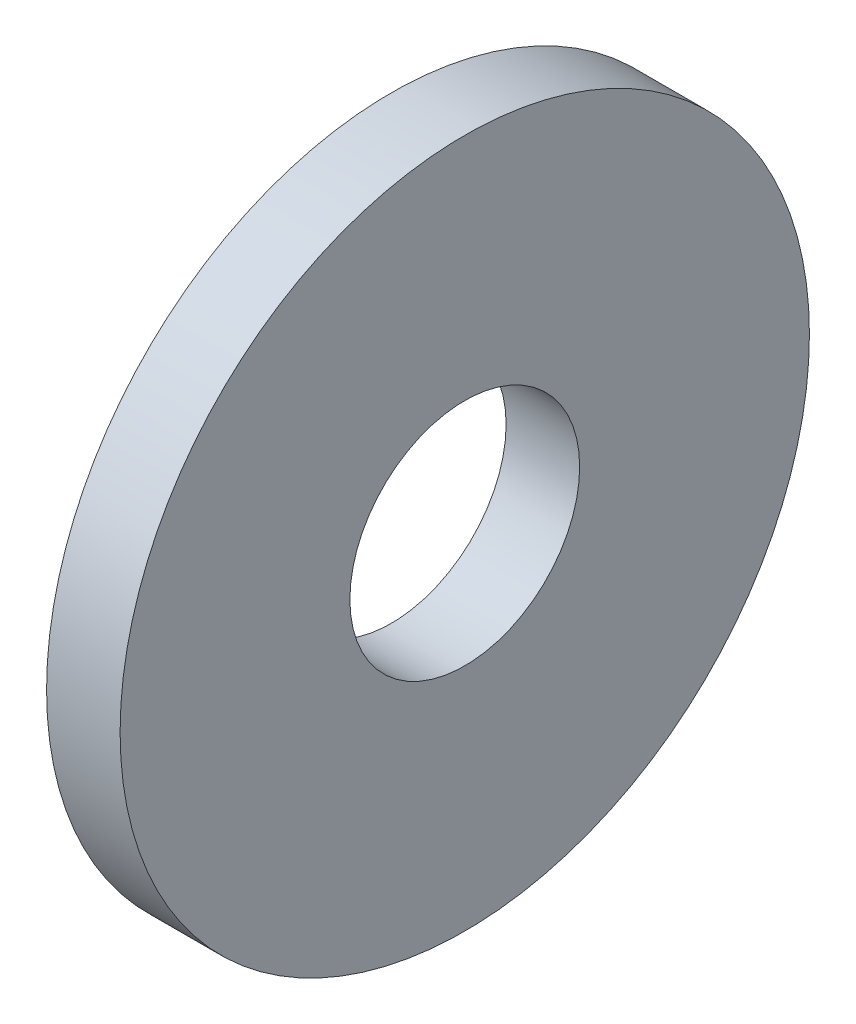
ISO-10303-21;
HEADER;
FILE_DESCRIPTION(('STEP AP214'),'2;1');
FILE_NAME('part.step','',(''),(''),'','','');
FILE_SCHEMA(('AUTOMOTIVE_DESIGN { 1 0 10303 214 1 1 1 1 }'));
ENDSEC;
DATA;
#1=APPLICATION_CONTEXT('core data for automotive mechanical design processes');
#2=APPLICATION_PROTOCOL_DEFINITION('international standard','automotive_design',2000,#1);
#3=PRODUCT_CONTEXT('',#1,'mechanical');
#4=PRODUCT('Part','Part','',(#3));
#5=PRODUCT_RELATED_PRODUCT_CATEGORY('part','',(#4));
#6=PRODUCT_DEFINITION_FORMATION('','',#4);
#7=PRODUCT_DEFINITION_CONTEXT('part definition',#1,'design');
#8=PRODUCT_DEFINITION('design','',#6,#7);
#9=PRODUCT_DEFINITION_SHAPE('','',#8);
#10=(LENGTH_UNIT() NAMED_UNIT(*) SI_UNIT(.MILLI.,.METRE.));
#11=(NAMED_UNIT(*) PLANE_ANGLE_UNIT() SI_UNIT($,.RADIAN.));
#12=(NAMED_UNIT(*) SI_UNIT($,.STERADIAN.) SOLID_ANGLE_UNIT());
#13=UNCERTAINTY_MEASURE_WITH_UNIT(LENGTH_MEASURE(1.E-05),#10,'distance_accuracy_value','');
#14=(GEOMETRIC_REPRESENTATION_CONTEXT(3) GLOBAL_UNCERTAINTY_ASSIGNED_CONTEXT((#13)) GLOBAL_UNIT_ASSIGNED_CONTEXT((#10,
#11,#12)) REPRESENTATION_CONTEXT('',''));
#15=CARTESIAN_POINT('',(0.,0.,0.));
#16=DIRECTION('',(0.,0.,1.));
#17=DIRECTION('',(1.,0.,0.));
#18=AXIS2_PLACEMENT_3D('',#15,#16,#17);
#19=CARTESIAN_POINT('',(-34.9249999999999,0.,0.));
#20=DIRECTION('',(-1.,0.,0.));
#21=DIRECTION('',(0.,0.,1.));
#22=AXIS2_PLACEMENT_3D('',#19,#20,#21);
#23=CYLINDRICAL_SURFACE('',#22,1.5875);
#24=CARTESIAN_POINT('',(0.,0.,0.));
#25=DIRECTION('',(-1.,0.,0.));
#26=DIRECTION('',(0.,0.,1.));
#27=AXIS2_PLACEMENT_3D('',#24,#25,#26);
#28=CIRCLE('',#27,1.5875);
#29=CARTESIAN_POINT('',(0.,0.,1.5875));
#30=VERTEX_POINT('',#29);
#31=EDGE_CURVE('E10',#30,#30,#28,.T.);
#32=ORIENTED_EDGE('',*,*,#31,.F.);
#33=EDGE_LOOP('',(#32));
#34=FACE_BOUND('',#33,.T.);
#35=CARTESIAN_POINT('',(-1.016,0.,0.));
#36=DIRECTION('',(-1.,0.,0.));
#37=DIRECTION('',(0.,0.,1.));
#38=AXIS2_PLACEMENT_3D('',#35,#36,#37);
#39=CIRCLE('',#38,1.5875);
#40=CARTESIAN_POINT('',(-1.016,0.,1.5875));
#41=VERTEX_POINT('',#40);
#42=EDGE_CURVE('E45',#41,#41,#39,.T.);
#43=ORIENTED_EDGE('',*,*,#42,.T.);
#44=EDGE_LOOP('',(#43));
#45=FACE_BOUND('',#44,.T.);
#46=ADVANCED_FACE('F31',(#34,#45),#23,.F.);
#47=CARTESIAN_POINT('',(0.,1.5875,0.));
#48=DIRECTION('',(-1.,0.,0.));
#49=DIRECTION('',(0.,0.,1.));
#50=AXIS2_PLACEMENT_3D('',#47,#48,#49);
#51=PLANE('',#50);
#52=CARTESIAN_POINT('',(0.,0.,0.));
#53=DIRECTION('',(-1.,0.,0.));
#54=DIRECTION('',(0.,0.,1.));
#55=AXIS2_PLACEMENT_3D('',#52,#53,#54);
#56=CIRCLE('',#55,4.7625);
#57=CARTESIAN_POINT('',(0.,0.,4.7625));
#58=VERTEX_POINT('',#57);
#59=EDGE_CURVE('E37',#58,#58,#56,.T.);
#60=ORIENTED_EDGE('',*,*,#59,.F.);
#61=EDGE_LOOP('',(#60));
#62=FACE_BOUND('',#61,.T.);
#63=ORIENTED_EDGE('',*,*,#31,.T.);
#64=EDGE_LOOP('',(#63));
#65=FACE_BOUND('',#64,.T.);
#66=ADVANCED_FACE('F60',(#62,#65),#51,.F.);
#67=CARTESIAN_POINT('',(-34.9249999999999,0.,0.));
#68=DIRECTION('',(-1.,0.,0.));
#69=DIRECTION('',(0.,0.,1.));
#70=AXIS2_PLACEMENT_3D('',#67,#68,#69);
#71=CYLINDRICAL_SURFACE('',#70,4.7625);
#72=CARTESIAN_POINT('',(-1.016,0.,0.));
#73=DIRECTION('',(-1.,0.,0.));
#74=DIRECTION('',(0.,0.,1.));
#75=AXIS2_PLACEMENT_3D('',#72,#73,#74);
#76=CIRCLE('',#75,4.7625);
#77=CARTESIAN_POINT('',(-1.016,0.,4.7625));
#78=VERTEX_POINT('',#77);
#79=EDGE_CURVE('E41',#78,#78,#76,.T.);
#80=ORIENTED_EDGE('',*,*,#79,.F.);
#81=EDGE_LOOP('',(#80));
#82=FACE_BOUND('',#81,.T.);
#83=ORIENTED_EDGE('',*,*,#59,.T.);
#84=EDGE_LOOP('',(#83));
#85=FACE_BOUND('',#84,.T.);
#86=ADVANCED_FACE('F55',(#82,#85),#71,.T.);
#87=CARTESIAN_POINT('',(-1.016,4.7625,0.));
#88=DIRECTION('',(1.,0.,0.));
#89=DIRECTION('',(0.,0.,-1.));
#90=AXIS2_PLACEMENT_3D('',#87,#88,#89);
#91=PLANE('',#90);
#92=ORIENTED_EDGE('',*,*,#42,.F.);
#93=EDGE_LOOP('',(#92));
#94=FACE_BOUND('',#93,.T.);
#95=ORIENTED_EDGE('',*,*,#79,.T.);
#96=EDGE_LOOP('',(#95));
#97=FACE_BOUND('',#96,.T.);
#98=ADVANCED_FACE('F52',(#94,#97),#91,.F.);
#99=CLOSED_SHELL('',(#46,#66,#86,#98));
#100=MANIFOLD_SOLID_BREP('B2',#99);
#101=ADVANCED_BREP_SHAPE_REPRESENTATION('',(#18,#100),#14);
#102=SHAPE_DEFINITION_REPRESENTATION(#9,#101);
ENDSEC;
END-ISO-10303-21;
